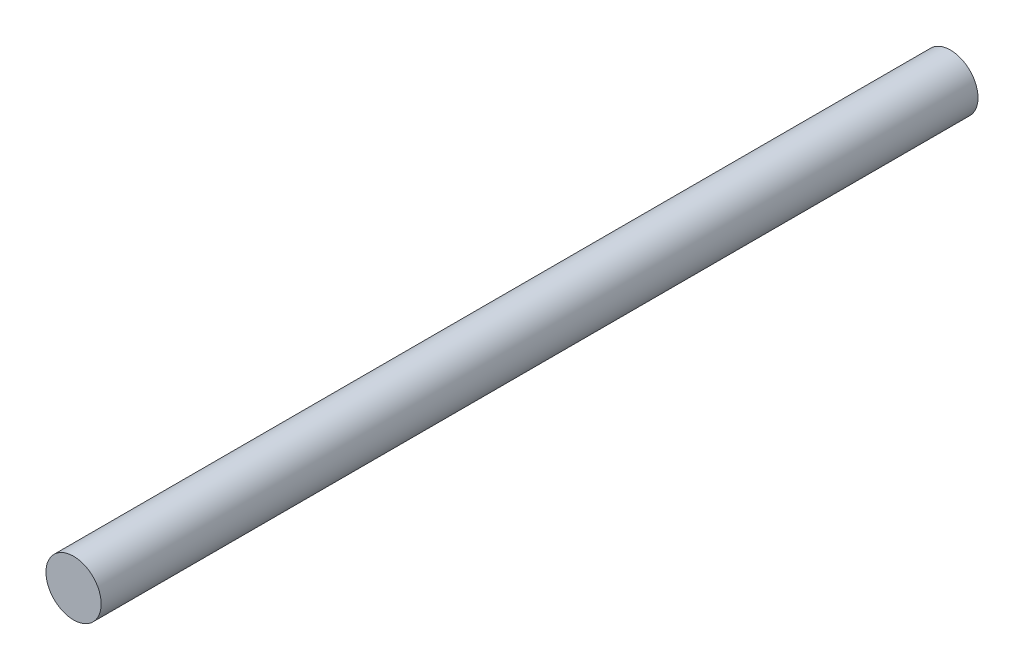
ISO-10303-21;
HEADER;
FILE_DESCRIPTION(('STEP AP214'),'2;1');
FILE_NAME('part.step','',(''),(''),'','','');
FILE_SCHEMA(('AUTOMOTIVE_DESIGN { 1 0 10303 214 1 1 1 1 }'));
ENDSEC;
DATA;
#1=APPLICATION_CONTEXT('core data for automotive mechanical design processes');
#2=APPLICATION_PROTOCOL_DEFINITION('international standard','automotive_design',2000,#1);
#3=PRODUCT_CONTEXT('',#1,'mechanical');
#4=PRODUCT('Part','Part','',(#3));
#5=PRODUCT_RELATED_PRODUCT_CATEGORY('part','',(#4));
#6=PRODUCT_DEFINITION_FORMATION('','',#4);
#7=PRODUCT_DEFINITION_CONTEXT('part definition',#1,'design');
#8=PRODUCT_DEFINITION('design','',#6,#7);
#9=PRODUCT_DEFINITION_SHAPE('','',#8);
#10=(LENGTH_UNIT() NAMED_UNIT(*) SI_UNIT(.MILLI.,.METRE.));
#11=(NAMED_UNIT(*) PLANE_ANGLE_UNIT() SI_UNIT($,.RADIAN.));
#12=(NAMED_UNIT(*) SI_UNIT($,.STERADIAN.) SOLID_ANGLE_UNIT());
#13=UNCERTAINTY_MEASURE_WITH_UNIT(LENGTH_MEASURE(1.E-05),#10,'distance_accuracy_value','');
#14=(GEOMETRIC_REPRESENTATION_CONTEXT(3) GLOBAL_UNCERTAINTY_ASSIGNED_CONTEXT((#13)) GLOBAL_UNIT_ASSIGNED_CONTEXT((#10,
#11,#12)) REPRESENTATION_CONTEXT('',''));
#15=CARTESIAN_POINT('',(0.,0.,0.));
#16=DIRECTION('',(0.,0.,1.));
#17=DIRECTION('',(1.,0.,0.));
#18=AXIS2_PLACEMENT_3D('',#15,#16,#17);
#19=CARTESIAN_POINT('',(0.,0.,127.));
#20=DIRECTION('',(0.,0.,-1.));
#21=DIRECTION('',(-1.,0.,0.));
#22=AXIS2_PLACEMENT_3D('',#19,#20,#21);
#23=CYLINDRICAL_SURFACE('',#22,4.);
#24=CARTESIAN_POINT('',(0.,0.,127.));
#25=DIRECTION('',(0.,0.,1.));
#26=DIRECTION('',(1.,0.,0.));
#27=AXIS2_PLACEMENT_3D('',#24,#25,#26);
#28=CIRCLE('',#27,4.);
#29=CARTESIAN_POINT('',(4.,0.,127.));
#30=VERTEX_POINT('',#29);
#31=EDGE_CURVE('E10',#30,#30,#28,.T.);
#32=ORIENTED_EDGE('',*,*,#31,.F.);
#33=EDGE_LOOP('',(#32));
#34=FACE_BOUND('',#33,.T.);
#35=CARTESIAN_POINT('',(0.,0.,0.));
#36=DIRECTION('',(0.,0.,1.));
#37=DIRECTION('',(1.,0.,0.));
#38=AXIS2_PLACEMENT_3D('',#35,#36,#37);
#39=CIRCLE('',#38,4.);
#40=CARTESIAN_POINT('',(4.,0.,0.));
#41=VERTEX_POINT('',#40);
#42=EDGE_CURVE('E35',#41,#41,#39,.T.);
#43=ORIENTED_EDGE('',*,*,#42,.T.);
#44=EDGE_LOOP('',(#43));
#45=FACE_BOUND('',#44,.T.);
#46=ADVANCED_FACE('F32',(#34,#45),#23,.T.);
#47=CARTESIAN_POINT('',(0.,0.,127.));
#48=DIRECTION('',(0.,0.,1.));
#49=DIRECTION('',(1.,0.,0.));
#50=AXIS2_PLACEMENT_3D('',#47,#48,#49);
#51=PLANE('',#50);
#52=ORIENTED_EDGE('',*,*,#31,.T.);
#53=EDGE_LOOP('',(#52));
#54=FACE_BOUND('',#53,.T.);
#55=ADVANCED_FACE('F47',(#54),#51,.T.);
#56=CARTESIAN_POINT('',(0.,0.,0.));
#57=DIRECTION('',(0.,0.,1.));
#58=DIRECTION('',(1.,0.,0.));
#59=AXIS2_PLACEMENT_3D('',#56,#57,#58);
#60=PLANE('',#59);
#61=ORIENTED_EDGE('',*,*,#42,.F.);
#62=EDGE_LOOP('',(#61));
#63=FACE_BOUND('',#62,.T.);
#64=ADVANCED_FACE('F45',(#63),#60,.F.);
#65=CLOSED_SHELL('',(#46,#55,#64));
#66=MANIFOLD_SOLID_BREP('B2',#65);
#67=ADVANCED_BREP_SHAPE_REPRESENTATION('',(#18,#66),#14);
#68=SHAPE_DEFINITION_REPRESENTATION(#9,#67);
ENDSEC;
END-ISO-10303-21;
